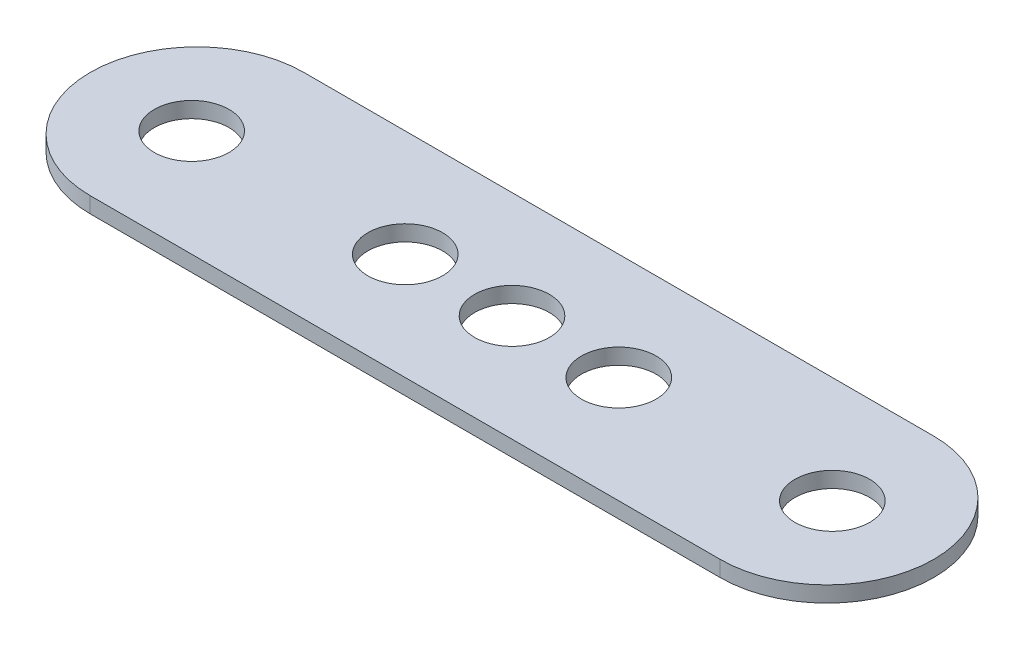
ISO-10303-21;
HEADER;
FILE_DESCRIPTION(('STEP AP214'),'2;1');
FILE_NAME('part.step','',(''),(''),'','','');
FILE_SCHEMA(('AUTOMOTIVE_DESIGN { 1 0 10303 214 1 1 1 1 }'));
ENDSEC;
DATA;
#1=APPLICATION_CONTEXT('core data for automotive mechanical design processes');
#2=APPLICATION_PROTOCOL_DEFINITION('international standard','automotive_design',2000,#1);
#3=PRODUCT_CONTEXT('',#1,'mechanical');
#4=PRODUCT('Part','Part','',(#3));
#5=PRODUCT_RELATED_PRODUCT_CATEGORY('part','',(#4));
#6=PRODUCT_DEFINITION_FORMATION('','',#4);
#7=PRODUCT_DEFINITION_CONTEXT('part definition',#1,'design');
#8=PRODUCT_DEFINITION('design','',#6,#7);
#9=PRODUCT_DEFINITION_SHAPE('','',#8);
#10=(LENGTH_UNIT() NAMED_UNIT(*) SI_UNIT(.MILLI.,.METRE.));
#11=(NAMED_UNIT(*) PLANE_ANGLE_UNIT() SI_UNIT($,.RADIAN.));
#12=(NAMED_UNIT(*) SI_UNIT($,.STERADIAN.) SOLID_ANGLE_UNIT());
#13=UNCERTAINTY_MEASURE_WITH_UNIT(LENGTH_MEASURE(1.E-05),#10,'distance_accuracy_value','');
#14=(GEOMETRIC_REPRESENTATION_CONTEXT(3) GLOBAL_UNCERTAINTY_ASSIGNED_CONTEXT((#13)) GLOBAL_UNIT_ASSIGNED_CONTEXT((#10,
#11,#12)) REPRESENTATION_CONTEXT('',''));
#15=CARTESIAN_POINT('',(0.,0.,0.));
#16=DIRECTION('',(0.,0.,1.));
#17=DIRECTION('',(1.,0.,0.));
#18=AXIS2_PLACEMENT_3D('',#15,#16,#17);
#19=CARTESIAN_POINT('',(0.,0.9398,6.35));
#20=DIRECTION('',(0.,0.,-1.));
#21=DIRECTION('',(-1.,0.,0.));
#22=AXIS2_PLACEMENT_3D('',#19,#20,#21);
#23=PLANE('',#22);
#24=DIRECTION('',(1.,0.,0.));
#25=VECTOR('',#24,1.);
#26=CARTESIAN_POINT('',(0.,0.,6.35));
#27=LINE('',#26,#25);
#28=CARTESIAN_POINT('',(-37.465,0.,6.35));
#29=VERTEX_POINT('',#28);
#30=CARTESIAN_POINT('',(0.,0.,6.35));
#31=VERTEX_POINT('',#30);
#32=EDGE_CURVE('E109',#29,#31,#27,.T.);
#33=ORIENTED_EDGE('',*,*,#32,.T.);
#34=DIRECTION('',(0.,-1.,0.));
#35=VECTOR('',#34,1.);
#36=CARTESIAN_POINT('',(0.,0.9398,6.35));
#37=LINE('',#36,#35);
#38=CARTESIAN_POINT('',(0.,0.9398,6.35));
#39=VERTEX_POINT('',#38);
#40=EDGE_CURVE('E93',#39,#31,#37,.T.);
#41=ORIENTED_EDGE('',*,*,#40,.F.);
#42=DIRECTION('',(1.,0.,0.));
#43=VECTOR('',#42,1.);
#44=CARTESIAN_POINT('',(0.,0.9398,6.35));
#45=LINE('',#44,#43);
#46=CARTESIAN_POINT('',(-37.465,0.9398,6.35));
#47=VERTEX_POINT('',#46);
#48=EDGE_CURVE('E87',#47,#39,#45,.T.);
#49=ORIENTED_EDGE('',*,*,#48,.F.);
#50=DIRECTION('',(0.,-1.,0.));
#51=VECTOR('',#50,1.);
#52=CARTESIAN_POINT('',(-37.465,0.9398,6.35));
#53=LINE('',#52,#51);
#54=EDGE_CURVE('E98',#47,#29,#53,.T.);
#55=ORIENTED_EDGE('',*,*,#54,.T.);
#56=EDGE_LOOP('',(#33,#41,#49,#55));
#57=FACE_BOUND('',#56,.T.);
#58=ADVANCED_FACE('F33',(#57),#23,.F.);
#59=CARTESIAN_POINT('',(0.,0.9398,0.));
#60=DIRECTION('',(0.,-1.,0.));
#61=DIRECTION('',(0.,0.,-1.));
#62=AXIS2_PLACEMENT_3D('',#59,#60,#61);
#63=CYLINDRICAL_SURFACE('',#62,6.35);
#64=CARTESIAN_POINT('',(0.,0.,0.));
#65=DIRECTION('',(0.,1.,0.));
#66=DIRECTION('',(0.,0.,1.));
#67=AXIS2_PLACEMENT_3D('',#64,#65,#66);
#68=CIRCLE('',#67,6.35);
#69=CARTESIAN_POINT('',(0.,0.,-6.35));
#70=VERTEX_POINT('',#69);
#71=EDGE_CURVE('E92',#31,#70,#68,.T.);
#72=ORIENTED_EDGE('',*,*,#71,.T.);
#73=DIRECTION('',(0.,-1.,0.));
#74=VECTOR('',#73,1.);
#75=CARTESIAN_POINT('',(0.,0.9398,-6.35));
#76=LINE('',#75,#74);
#77=CARTESIAN_POINT('',(0.,0.9398,-6.35));
#78=VERTEX_POINT('',#77);
#79=EDGE_CURVE('E90',#78,#70,#76,.T.);
#80=ORIENTED_EDGE('',*,*,#79,.F.);
#81=CARTESIAN_POINT('',(0.,0.9398,0.));
#82=DIRECTION('',(0.,1.,0.));
#83=DIRECTION('',(0.,0.,1.));
#84=AXIS2_PLACEMENT_3D('',#81,#82,#83);
#85=CIRCLE('',#84,6.35);
#86=EDGE_CURVE('E81',#39,#78,#85,.T.);
#87=ORIENTED_EDGE('',*,*,#86,.F.);
#88=ORIENTED_EDGE('',*,*,#40,.T.);
#89=EDGE_LOOP('',(#72,#80,#87,#88));
#90=FACE_BOUND('',#89,.T.);
#91=ADVANCED_FACE('F91',(#90),#63,.T.);
#92=CARTESIAN_POINT('',(0.,0.9398,-6.35));
#93=DIRECTION('',(0.,0.,1.));
#94=DIRECTION('',(1.,0.,0.));
#95=AXIS2_PLACEMENT_3D('',#92,#93,#94);
#96=PLANE('',#95);
#97=DIRECTION('',(-1.,0.,0.));
#98=VECTOR('',#97,1.);
#99=CARTESIAN_POINT('',(0.,0.,-6.35));
#100=LINE('',#99,#98);
#101=CARTESIAN_POINT('',(-37.465,0.,-6.35));
#102=VERTEX_POINT('',#101);
#103=EDGE_CURVE('E67',#70,#102,#100,.T.);
#104=ORIENTED_EDGE('',*,*,#103,.T.);
#105=DIRECTION('',(0.,-1.,0.));
#106=VECTOR('',#105,1.);
#107=CARTESIAN_POINT('',(-37.465,0.9398,-6.35));
#108=LINE('',#107,#106);
#109=CARTESIAN_POINT('',(-37.465,0.9398,-6.35));
#110=VERTEX_POINT('',#109);
#111=EDGE_CURVE('E94',#110,#102,#108,.T.);
#112=ORIENTED_EDGE('',*,*,#111,.F.);
#113=DIRECTION('',(-1.,0.,0.));
#114=VECTOR('',#113,1.);
#115=CARTESIAN_POINT('',(0.,0.9398,-6.35));
#116=LINE('',#115,#114);
#117=EDGE_CURVE('E85',#78,#110,#116,.T.);
#118=ORIENTED_EDGE('',*,*,#117,.F.);
#119=ORIENTED_EDGE('',*,*,#79,.T.);
#120=EDGE_LOOP('',(#104,#112,#118,#119));
#121=FACE_BOUND('',#120,.T.);
#122=ADVANCED_FACE('F96',(#121),#96,.F.);
#123=CARTESIAN_POINT('',(0.317500000000001,0.9398,0.));
#124=DIRECTION('',(0.,-1.,0.));
#125=DIRECTION('',(0.,0.,-1.));
#126=AXIS2_PLACEMENT_3D('',#123,#124,#125);
#127=CYLINDRICAL_SURFACE('',#126,2.2225);
#128=CARTESIAN_POINT('',(0.317500000000001,0.9398,0.));
#129=DIRECTION('',(0.,1.,0.));
#130=DIRECTION('',(0.,0.,1.));
#131=AXIS2_PLACEMENT_3D('',#128,#129,#130);
#132=CIRCLE('',#131,2.2225);
#133=CARTESIAN_POINT('',(0.317500000000001,0.9398,2.2225));
#134=VERTEX_POINT('',#133);
#135=EDGE_CURVE('E168',#134,#134,#132,.T.);
#136=ORIENTED_EDGE('',*,*,#135,.T.);
#137=EDGE_LOOP('',(#136));
#138=FACE_BOUND('',#137,.T.);
#139=CARTESIAN_POINT('',(0.317500000000001,0.,0.));
#140=DIRECTION('',(0.,1.,0.));
#141=DIRECTION('',(0.,0.,1.));
#142=AXIS2_PLACEMENT_3D('',#139,#140,#141);
#143=CIRCLE('',#142,2.2225);
#144=CARTESIAN_POINT('',(0.317500000000001,0.,2.2225));
#145=VERTEX_POINT('',#144);
#146=EDGE_CURVE('E105',#145,#145,#143,.T.);
#147=ORIENTED_EDGE('',*,*,#146,.F.);
#148=EDGE_LOOP('',(#147));
#149=FACE_BOUND('',#148,.T.);
#150=ADVANCED_FACE('F152',(#138,#149),#127,.F.);
#151=CARTESIAN_POINT('',(-37.7825,0.9398,0.));
#152=DIRECTION('',(0.,-1.,0.));
#153=DIRECTION('',(0.,0.,-1.));
#154=AXIS2_PLACEMENT_3D('',#151,#152,#153);
#155=CYLINDRICAL_SURFACE('',#154,2.2225);
#156=CARTESIAN_POINT('',(-37.7825,0.9398,0.));
#157=DIRECTION('',(0.,1.,0.));
#158=DIRECTION('',(0.,0.,1.));
#159=AXIS2_PLACEMENT_3D('',#156,#157,#158);
#160=CIRCLE('',#159,2.2225);
#161=CARTESIAN_POINT('',(-37.7825,0.9398,2.2225));
#162=VERTEX_POINT('',#161);
#163=EDGE_CURVE('E115',#162,#162,#160,.T.);
#164=ORIENTED_EDGE('',*,*,#163,.T.);
#165=EDGE_LOOP('',(#164));
#166=FACE_BOUND('',#165,.T.);
#167=CARTESIAN_POINT('',(-37.7825,0.,0.));
#168=DIRECTION('',(0.,1.,0.));
#169=DIRECTION('',(0.,0.,1.));
#170=AXIS2_PLACEMENT_3D('',#167,#168,#169);
#171=CIRCLE('',#170,2.2225);
#172=CARTESIAN_POINT('',(-37.7825,0.,2.2225));
#173=VERTEX_POINT('',#172);
#174=EDGE_CURVE('E102',#173,#173,#171,.T.);
#175=ORIENTED_EDGE('',*,*,#174,.F.);
#176=EDGE_LOOP('',(#175));
#177=FACE_BOUND('',#176,.T.);
#178=ADVANCED_FACE('F138',(#166,#177),#155,.F.);
#179=CARTESIAN_POINT('',(-37.465,0.9398,0.));
#180=DIRECTION('',(0.,-1.,0.));
#181=DIRECTION('',(0.,0.,-1.));
#182=AXIS2_PLACEMENT_3D('',#179,#180,#181);
#183=CYLINDRICAL_SURFACE('',#182,6.35);
#184=CARTESIAN_POINT('',(-37.465,0.,0.));
#185=DIRECTION('',(0.,1.,0.));
#186=DIRECTION('',(0.,0.,1.));
#187=AXIS2_PLACEMENT_3D('',#184,#185,#186);
#188=CIRCLE('',#187,6.35);
#189=EDGE_CURVE('E73',#102,#29,#188,.T.);
#190=ORIENTED_EDGE('',*,*,#189,.T.);
#191=ORIENTED_EDGE('',*,*,#54,.F.);
#192=CARTESIAN_POINT('',(-37.465,0.9398,0.));
#193=DIRECTION('',(0.,1.,0.));
#194=DIRECTION('',(0.,0.,1.));
#195=AXIS2_PLACEMENT_3D('',#192,#193,#194);
#196=CIRCLE('',#195,6.35);
#197=EDGE_CURVE('E50',#110,#47,#196,.T.);
#198=ORIENTED_EDGE('',*,*,#197,.F.);
#199=ORIENTED_EDGE('',*,*,#111,.T.);
#200=EDGE_LOOP('',(#190,#191,#198,#199));
#201=FACE_BOUND('',#200,.T.);
#202=ADVANCED_FACE('F128',(#201),#183,.T.);
#203=CARTESIAN_POINT('',(0.,0.9398,0.));
#204=DIRECTION('',(0.,1.,0.));
#205=DIRECTION('',(0.,0.,1.));
#206=AXIS2_PLACEMENT_3D('',#203,#204,#205);
#207=PLANE('',#206);
#208=CARTESIAN_POINT('',(-18.7325,0.9398,0.));
#209=DIRECTION('',(0.,1.,0.));
#210=DIRECTION('',(0.,0.,1.));
#211=AXIS2_PLACEMENT_3D('',#208,#209,#210);
#212=CIRCLE('',#211,2.2225);
#213=CARTESIAN_POINT('',(-18.7325,0.9398,2.2225));
#214=VERTEX_POINT('',#213);
#215=EDGE_CURVE('E176',#214,#214,#212,.T.);
#216=ORIENTED_EDGE('',*,*,#215,.F.);
#217=EDGE_LOOP('',(#216));
#218=FACE_BOUND('',#217,.T.);
#219=CARTESIAN_POINT('',(-25.0825,0.9398,0.));
#220=DIRECTION('',(0.,1.,0.));
#221=DIRECTION('',(0.,0.,1.));
#222=AXIS2_PLACEMENT_3D('',#219,#220,#221);
#223=CIRCLE('',#222,2.2225);
#224=CARTESIAN_POINT('',(-25.0825,0.9398,2.2225));
#225=VERTEX_POINT('',#224);
#226=EDGE_CURVE('E173',#225,#225,#223,.T.);
#227=ORIENTED_EDGE('',*,*,#226,.F.);
#228=EDGE_LOOP('',(#227));
#229=FACE_BOUND('',#228,.T.);
#230=ORIENTED_EDGE('',*,*,#163,.F.);
#231=EDGE_LOOP('',(#230));
#232=FACE_BOUND('',#231,.T.);
#233=ORIENTED_EDGE('',*,*,#135,.F.);
#234=EDGE_LOOP('',(#233));
#235=FACE_BOUND('',#234,.T.);
#236=ORIENTED_EDGE('',*,*,#48,.T.);
#237=ORIENTED_EDGE('',*,*,#86,.T.);
#238=ORIENTED_EDGE('',*,*,#117,.T.);
#239=ORIENTED_EDGE('',*,*,#197,.T.);
#240=EDGE_LOOP('',(#236,#237,#238,#239));
#241=FACE_BOUND('',#240,.T.);
#242=CARTESIAN_POINT('',(-12.3825,0.9398,0.));
#243=DIRECTION('',(0.,1.,0.));
#244=DIRECTION('',(0.,0.,1.));
#245=AXIS2_PLACEMENT_3D('',#242,#243,#244);
#246=CIRCLE('',#245,2.2225);
#247=CARTESIAN_POINT('',(-12.3825,0.9398,2.2225));
#248=VERTEX_POINT('',#247);
#249=EDGE_CURVE('E11',#248,#248,#246,.T.);
#250=ORIENTED_EDGE('',*,*,#249,.F.);
#251=EDGE_LOOP('',(#250));
#252=FACE_BOUND('',#251,.T.);
#253=ADVANCED_FACE('F82',(#218,#229,#232,#235,#241,#252),#207,.T.);
#254=CARTESIAN_POINT('',(0.,0.,0.));
#255=DIRECTION('',(0.,1.,0.));
#256=DIRECTION('',(0.,0.,1.));
#257=AXIS2_PLACEMENT_3D('',#254,#255,#256);
#258=PLANE('',#257);
#259=CARTESIAN_POINT('',(-18.7325,0.,0.));
#260=DIRECTION('',(0.,1.,0.));
#261=DIRECTION('',(0.,0.,1.));
#262=AXIS2_PLACEMENT_3D('',#259,#260,#261);
#263=CIRCLE('',#262,2.2225);
#264=CARTESIAN_POINT('',(-18.7325,0.,2.2225));
#265=VERTEX_POINT('',#264);
#266=EDGE_CURVE('E181',#265,#265,#263,.T.);
#267=ORIENTED_EDGE('',*,*,#266,.T.);
#268=EDGE_LOOP('',(#267));
#269=FACE_BOUND('',#268,.T.);
#270=CARTESIAN_POINT('',(-25.0825,0.,0.));
#271=DIRECTION('',(0.,1.,0.));
#272=DIRECTION('',(0.,0.,1.));
#273=AXIS2_PLACEMENT_3D('',#270,#271,#272);
#274=CIRCLE('',#273,2.2225);
#275=CARTESIAN_POINT('',(-25.0825,0.,2.2225));
#276=VERTEX_POINT('',#275);
#277=EDGE_CURVE('E106',#276,#276,#274,.T.);
#278=ORIENTED_EDGE('',*,*,#277,.T.);
#279=EDGE_LOOP('',(#278));
#280=FACE_BOUND('',#279,.T.);
#281=ORIENTED_EDGE('',*,*,#174,.T.);
#282=EDGE_LOOP('',(#281));
#283=FACE_BOUND('',#282,.T.);
#284=ORIENTED_EDGE('',*,*,#146,.T.);
#285=EDGE_LOOP('',(#284));
#286=FACE_BOUND('',#285,.T.);
#287=ORIENTED_EDGE('',*,*,#32,.F.);
#288=ORIENTED_EDGE('',*,*,#189,.F.);
#289=ORIENTED_EDGE('',*,*,#103,.F.);
#290=ORIENTED_EDGE('',*,*,#71,.F.);
#291=EDGE_LOOP('',(#287,#288,#289,#290));
#292=FACE_BOUND('',#291,.T.);
#293=CARTESIAN_POINT('',(-12.3825,0.,0.));
#294=DIRECTION('',(0.,1.,0.));
#295=DIRECTION('',(0.,0.,1.));
#296=AXIS2_PLACEMENT_3D('',#293,#294,#295);
#297=CIRCLE('',#296,2.2225);
#298=CARTESIAN_POINT('',(-12.3825,0.,2.2225));
#299=VERTEX_POINT('',#298);
#300=EDGE_CURVE('E42',#299,#299,#297,.T.);
#301=ORIENTED_EDGE('',*,*,#300,.T.);
#302=EDGE_LOOP('',(#301));
#303=FACE_BOUND('',#302,.T.);
#304=ADVANCED_FACE('F121',(#269,#280,#283,#286,#292,#303),#258,.F.);
#305=CARTESIAN_POINT('',(-25.0825,0.,0.));
#306=DIRECTION('',(0.,1.,0.));
#307=DIRECTION('',(0.,0.,1.));
#308=AXIS2_PLACEMENT_3D('',#305,#306,#307);
#309=CYLINDRICAL_SURFACE('',#308,2.2225);
#310=ORIENTED_EDGE('',*,*,#277,.F.);
#311=EDGE_LOOP('',(#310));
#312=FACE_BOUND('',#311,.T.);
#313=ORIENTED_EDGE('',*,*,#226,.T.);
#314=EDGE_LOOP('',(#313));
#315=FACE_BOUND('',#314,.T.);
#316=ADVANCED_FACE('F135',(#312,#315),#309,.F.);
#317=CARTESIAN_POINT('',(-18.7325,0.,0.));
#318=DIRECTION('',(0.,1.,0.));
#319=DIRECTION('',(0.,0.,1.));
#320=AXIS2_PLACEMENT_3D('',#317,#318,#319);
#321=CYLINDRICAL_SURFACE('',#320,2.2225);
#322=ORIENTED_EDGE('',*,*,#266,.F.);
#323=EDGE_LOOP('',(#322));
#324=FACE_BOUND('',#323,.T.);
#325=ORIENTED_EDGE('',*,*,#215,.T.);
#326=EDGE_LOOP('',(#325));
#327=FACE_BOUND('',#326,.T.);
#328=ADVANCED_FACE('F125',(#324,#327),#321,.F.);
#329=CARTESIAN_POINT('',(-12.3825,0.,0.));
#330=DIRECTION('',(0.,1.,0.));
#331=DIRECTION('',(0.,0.,1.));
#332=AXIS2_PLACEMENT_3D('',#329,#330,#331);
#333=CYLINDRICAL_SURFACE('',#332,2.2225);
#334=ORIENTED_EDGE('',*,*,#300,.F.);
#335=EDGE_LOOP('',(#334));
#336=FACE_BOUND('',#335,.T.);
#337=ORIENTED_EDGE('',*,*,#249,.T.);
#338=EDGE_LOOP('',(#337));
#339=FACE_BOUND('',#338,.T.);
#340=ADVANCED_FACE('F35',(#336,#339),#333,.F.);
#341=CLOSED_SHELL('',(#58,#91,#122,#150,#178,#202,#253,#304,#316,#328,#340));
#342=MANIFOLD_SOLID_BREP('B2',#341);
#343=ADVANCED_BREP_SHAPE_REPRESENTATION('',(#18,#342),#14);
#344=SHAPE_DEFINITION_REPRESENTATION(#9,#343);
ENDSEC;
END-ISO-10303-21;
